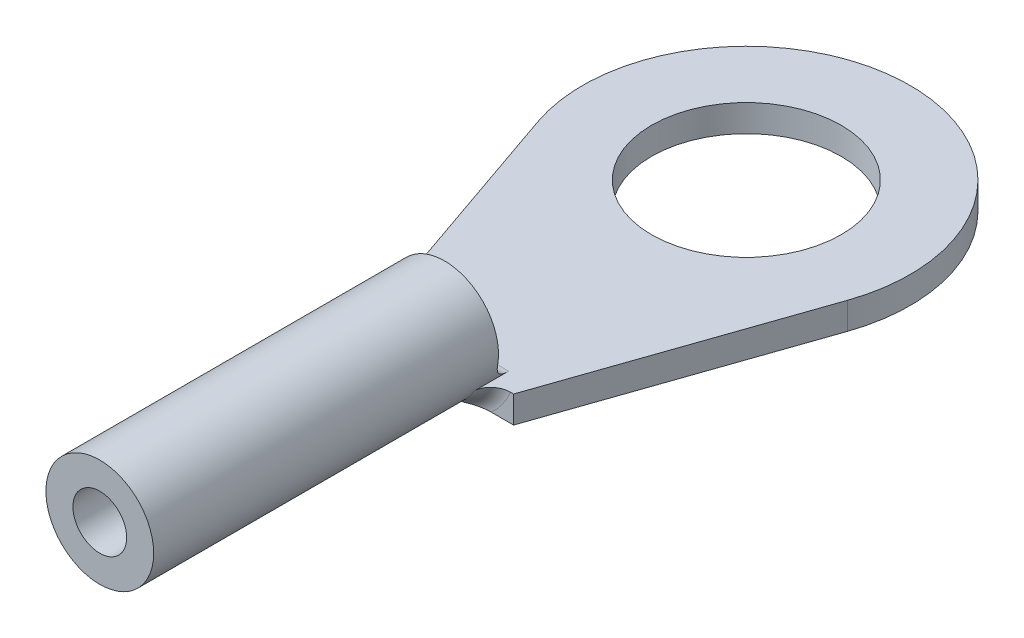
ISO-10303-21;
HEADER;
FILE_DESCRIPTION(('STEP AP214'),'2;1');
FILE_NAME('part.step','',(''),(''),'','','');
FILE_SCHEMA(('AUTOMOTIVE_DESIGN { 1 0 10303 214 1 1 1 1 }'));
ENDSEC;
DATA;
#1=APPLICATION_CONTEXT('core data for automotive mechanical design processes');
#2=APPLICATION_PROTOCOL_DEFINITION('international standard','automotive_design',2000,#1);
#3=PRODUCT_CONTEXT('',#1,'mechanical');
#4=PRODUCT('Part','Part','',(#3));
#5=PRODUCT_RELATED_PRODUCT_CATEGORY('part','',(#4));
#6=PRODUCT_DEFINITION_FORMATION('','',#4);
#7=PRODUCT_DEFINITION_CONTEXT('part definition',#1,'design');
#8=PRODUCT_DEFINITION('design','',#6,#7);
#9=PRODUCT_DEFINITION_SHAPE('','',#8);
#10=(LENGTH_UNIT() NAMED_UNIT(*) SI_UNIT(.MILLI.,.METRE.));
#11=(NAMED_UNIT(*) PLANE_ANGLE_UNIT() SI_UNIT($,.RADIAN.));
#12=(NAMED_UNIT(*) SI_UNIT($,.STERADIAN.) SOLID_ANGLE_UNIT());
#13=UNCERTAINTY_MEASURE_WITH_UNIT(LENGTH_MEASURE(1.E-05),#10,'distance_accuracy_value','');
#14=(GEOMETRIC_REPRESENTATION_CONTEXT(3) GLOBAL_UNCERTAINTY_ASSIGNED_CONTEXT((#13)) GLOBAL_UNIT_ASSIGNED_CONTEXT((#10,
#11,#12)) REPRESENTATION_CONTEXT('',''));
#15=CARTESIAN_POINT('',(0.,0.,0.));
#16=DIRECTION('',(0.,0.,1.));
#17=DIRECTION('',(1.,0.,0.));
#18=AXIS2_PLACEMENT_3D('',#15,#16,#17);
#19=CARTESIAN_POINT('',(1.016,0.396875,4.445));
#20=DIRECTION('',(0.,0.,-1.));
#21=DIRECTION('',(-1.,0.,0.));
#22=AXIS2_PLACEMENT_3D('',#19,#20,#21);
#23=PLANE('',#22);
#24=DIRECTION('',(1.,0.,0.));
#25=VECTOR('',#24,1.);
#26=CARTESIAN_POINT('',(1.016,0.,4.445));
#27=LINE('',#26,#25);
#28=CARTESIAN_POINT('',(-1.016,0.,4.445));
#29=VERTEX_POINT('',#28);
#30=CARTESIAN_POINT('',(-0.684874153211491,0.,4.445));
#31=VERTEX_POINT('',#30);
#32=EDGE_CURVE('E200',#29,#31,#27,.T.);
#33=ORIENTED_EDGE('',*,*,#32,.T.);
#34=CARTESIAN_POINT('',(0.,0.792923361216481,4.445));
#35=DIRECTION('',(0.,0.,-1.));
#36=DIRECTION('',(-1.,0.,0.));
#37=AXIS2_PLACEMENT_3D('',#34,#35,#36);
#38=CIRCLE('',#37,1.04775);
#39=CARTESIAN_POINT('',(-0.97001327726879,0.396875,4.445));
#40=VERTEX_POINT('',#39);
#41=EDGE_CURVE('E386',#31,#40,#38,.T.);
#42=ORIENTED_EDGE('',*,*,#41,.T.);
#43=DIRECTION('',(1.,0.,0.));
#44=VECTOR('',#43,1.);
#45=CARTESIAN_POINT('',(1.016,0.396875,4.445));
#46=LINE('',#45,#44);
#47=CARTESIAN_POINT('',(-1.016,0.396875,4.445));
#48=VERTEX_POINT('',#47);
#49=EDGE_CURVE('E363',#48,#40,#46,.T.);
#50=ORIENTED_EDGE('',*,*,#49,.F.);
#51=DIRECTION('',(0.,-1.,0.));
#52=VECTOR('',#51,1.);
#53=CARTESIAN_POINT('',(-1.016,0.396875,4.445));
#54=LINE('',#53,#52);
#55=EDGE_CURVE('E155',#48,#29,#54,.T.);
#56=ORIENTED_EDGE('',*,*,#55,.T.);
#57=EDGE_LOOP('',(#33,#42,#50,#56));
#58=FACE_BOUND('',#57,.T.);
#59=ADVANCED_FACE('F41',(#58),#23,.F.);
#60=CARTESIAN_POINT('',(0.,0.396875,0.));
#61=DIRECTION('',(0.,1.,0.));
#62=DIRECTION('',(0.,0.,1.));
#63=AXIS2_PLACEMENT_3D('',#60,#61,#62);
#64=PLANE('',#63);
#65=DIRECTION('',(1.,0.,0.));
#66=VECTOR('',#65,1.);
#67=CARTESIAN_POINT('',(0.,0.396875,4.191));
#68=LINE('',#67,#66);
#69=CARTESIAN_POINT('',(0.369697940889549,0.396875,4.191));
#70=VERTEX_POINT('',#69);
#71=CARTESIAN_POINT('',(0.687884262123898,0.396875,4.191));
#72=VERTEX_POINT('',#71);
#73=EDGE_CURVE('E285',#70,#72,#68,.T.);
#74=ORIENTED_EDGE('',*,*,#73,.T.);
#75=DIRECTION('',(0.,0.,-1.));
#76=VECTOR('',#75,1.);
#77=CARTESIAN_POINT('',(0.687884262123898,0.396875,9.525));
#78=LINE('',#77,#76);
#79=CARTESIAN_POINT('',(0.687884262116823,0.396875,4.69900000000365));
#80=VERTEX_POINT('',#79);
#81=EDGE_CURVE('E382',#80,#72,#78,.T.);
#82=ORIENTED_EDGE('',*,*,#81,.F.);
#83=CARTESIAN_POINT('',(0.97001327726879,0.396875,4.445));
#84=CARTESIAN_POINT('',(0.953113168477081,0.396875,4.44499379979826));
#85=CARTESIAN_POINT('',(0.936221132894472,0.396875,4.44644537969703));
#86=CARTESIAN_POINT('',(0.902913144314464,0.396875,4.45214806218975));
#87=CARTESIAN_POINT('',(0.886497251882933,0.396875,4.45639951931448));
#88=CARTESIAN_POINT('',(0.85460332847592,0.396875,4.46758679868527));
#89=CARTESIAN_POINT('',(0.839125455125773,0.396875,4.47452307065075));
#90=CARTESIAN_POINT('',(0.809568016035722,0.396875,4.49093199189131));
#91=CARTESIAN_POINT('',(0.795488696945248,0.396875,4.5004050874764));
#92=CARTESIAN_POINT('',(0.769428676180345,0.396875,4.52154168958541));
#93=CARTESIAN_POINT('',(0.757419245048958,0.396875,4.5331695894592));
#94=CARTESIAN_POINT('',(0.735777354986445,0.396875,4.55846071727123));
#95=CARTESIAN_POINT('',(0.72614251748817,0.396875,4.57212188635039));
#96=CARTESIAN_POINT('',(0.710599152501538,0.396875,4.59970711057377));
#97=CARTESIAN_POINT('',(0.70442066699444,0.396875,4.61347843939786));
#98=CARTESIAN_POINT('',(0.694855151516391,0.396875,4.64195689827558));
#99=CARTESIAN_POINT('',(0.691464774344167,0.396875,4.65666288332065));
#100=CARTESIAN_POINT('',(0.68797673927015,0.396875,4.6845135951715));
#101=CARTESIAN_POINT('',(0.687508445891591,0.396875,4.6976128675586));
#102=CARTESIAN_POINT('',(0.688879616707999,0.396875,4.72373802146532));
#103=CARTESIAN_POINT('',(0.69072758260189,0.396875,4.73676345530455));
#104=CARTESIAN_POINT('',(0.693734735208581,0.396875,4.74952321973601));
#105=B_SPLINE_CURVE_WITH_KNOTS('',3,(#83,#84,#85,#86,#87,#88,#89,#90,#91,#92,#93,#94,#95,#96,
#97,#98,#99,#100,#101,#102,#103,#104),.UNSPECIFIED.,.F.,.F.,(4,2,2,2,2,2,2,2,2,2,4),(0.,
0.0506277273101404,0.101261866522541,0.151904490870001,0.202556030767021,0.252435138837586,
0.302264079398994,0.347282094421044,0.392245984843998,0.43136681928469,0.470631665946946),.UNSPECIFIED.);
#106=CARTESIAN_POINT('',(0.97001327726879,0.396875,4.445));
#107=VERTEX_POINT('',#106);
#108=EDGE_CURVE('E229',#80,#107,#105,.F.);
#109=ORIENTED_EDGE('',*,*,#108,.T.);
#110=CARTESIAN_POINT('',(1.016,0.396875,4.445));
#111=VERTEX_POINT('',#110);
#112=EDGE_CURVE('E160',#107,#111,#46,.T.);
#113=ORIENTED_EDGE('',*,*,#112,.T.);
#114=DIRECTION('',(0.326838836782277,0.,-0.945080089077538));
#115=VECTOR('',#114,1.);
#116=CARTESIAN_POINT('',(2.2804782549441,0.396875,0.788662113155634));
#117=LINE('',#116,#115);
#118=CARTESIAN_POINT('',(2.2804782549441,0.396875,0.788662113155634));
#119=VERTEX_POINT('',#118);
#120=EDGE_CURVE('E168',#111,#119,#117,.T.);
#121=ORIENTED_EDGE('',*,*,#120,.T.);
#122=CARTESIAN_POINT('',(0.,0.396875,0.));
#123=DIRECTION('',(0.,1.,0.));
#124=DIRECTION('',(0.,0.,1.));
#125=AXIS2_PLACEMENT_3D('',#122,#123,#124);
#126=CIRCLE('',#125,2.413);
#127=CARTESIAN_POINT('',(-2.2804782549441,0.396875,0.788662113155635));
#128=VERTEX_POINT('',#127);
#129=EDGE_CURVE('E161',#119,#128,#126,.T.);
#130=ORIENTED_EDGE('',*,*,#129,.T.);
#131=DIRECTION('',(0.326838836782277,0.,0.945080089077538));
#132=VECTOR('',#131,1.);
#133=CARTESIAN_POINT('',(-1.016,0.396875,4.445));
#134=LINE('',#133,#132);
#135=EDGE_CURVE('E148',#128,#48,#134,.T.);
#136=ORIENTED_EDGE('',*,*,#135,.T.);
#137=ORIENTED_EDGE('',*,*,#49,.T.);
#138=CARTESIAN_POINT('',(-0.97001327726879,0.396875,4.445));
#139=CARTESIAN_POINT('',(-0.953113168477081,0.396875,4.44499379979826));
#140=CARTESIAN_POINT('',(-0.936221132894472,0.396875,4.44644537969703));
#141=CARTESIAN_POINT('',(-0.902913144314464,0.396875,4.45214806218975));
#142=CARTESIAN_POINT('',(-0.886497251882933,0.396875,4.45639951931448));
#143=CARTESIAN_POINT('',(-0.85460332847592,0.396875,4.46758679868527));
#144=CARTESIAN_POINT('',(-0.839125455125773,0.396875,4.47452307065075));
#145=CARTESIAN_POINT('',(-0.809568016035722,0.396875,4.49093199189131));
#146=CARTESIAN_POINT('',(-0.795488696945248,0.396875,4.5004050874764));
#147=CARTESIAN_POINT('',(-0.769428676180345,0.396875,4.52154168958541));
#148=CARTESIAN_POINT('',(-0.757419245048958,0.396875,4.5331695894592));
#149=CARTESIAN_POINT('',(-0.735777354986445,0.396875,4.55846071727123));
#150=CARTESIAN_POINT('',(-0.72614251748817,0.396875,4.57212188635039));
#151=CARTESIAN_POINT('',(-0.710599152501538,0.396875,4.59970711057377));
#152=CARTESIAN_POINT('',(-0.70442066699444,0.396875,4.61347843939786));
#153=CARTESIAN_POINT('',(-0.694855151516391,0.396875,4.64195689827558));
#154=CARTESIAN_POINT('',(-0.691464774344167,0.396875,4.65666288332065));
#155=CARTESIAN_POINT('',(-0.68797673927015,0.396875,4.6845135951715));
#156=CARTESIAN_POINT('',(-0.687508445891591,0.396875,4.6976128675586));
#157=CARTESIAN_POINT('',(-0.688879616707999,0.396875,4.72373802146532));
#158=CARTESIAN_POINT('',(-0.69072758260189,0.396875,4.73676345530455));
#159=CARTESIAN_POINT('',(-0.693734735208581,0.396875,4.74952321973601));
#160=B_SPLINE_CURVE_WITH_KNOTS('',3,(#138,#139,#140,#141,#142,#143,#144,#145,#146,#147,#148,
#149,#150,#151,#152,#153,#154,#155,#156,#157,#158,#159),.UNSPECIFIED.,.F.,.F.,(4,2,2,2,2,2,2,2,
2,2,4),(0.,0.0506277273101404,0.101261866522541,0.151904490870001,0.202556030767021,
0.252435138837586,0.302264079398994,0.347282094421044,0.392245984843998,0.43136681928469,
0.470631665946946),.UNSPECIFIED.);
#161=CARTESIAN_POINT('',(-0.687884262123898,0.396875,4.69900000000365));
#162=VERTEX_POINT('',#161);
#163=EDGE_CURVE('E259',#40,#162,#160,.T.);
#164=ORIENTED_EDGE('',*,*,#163,.T.);
#165=DIRECTION('',(0.,0.,-1.));
#166=VECTOR('',#165,1.);
#167=CARTESIAN_POINT('',(-0.687884262123898,0.396875,9.525));
#168=LINE('',#167,#166);
#169=CARTESIAN_POINT('',(-0.687884262123898,0.396875,4.191));
#170=VERTEX_POINT('',#169);
#171=EDGE_CURVE('E179',#170,#162,#168,.F.);
#172=ORIENTED_EDGE('',*,*,#171,.F.);
#173=DIRECTION('',(1.,0.,0.));
#174=VECTOR('',#173,1.);
#175=CARTESIAN_POINT('',(0.,0.396875,4.191));
#176=LINE('',#175,#174);
#177=CARTESIAN_POINT('',(-0.369697940889549,0.396875,4.191));
#178=VERTEX_POINT('',#177);
#179=EDGE_CURVE('E266',#170,#178,#176,.T.);
#180=ORIENTED_EDGE('',*,*,#179,.T.);
#181=CARTESIAN_POINT('',(-0.438050456634923,0.396875,4.19931485611738));
#182=CARTESIAN_POINT('',(-0.371528569790791,0.396875,4.46586516566242));
#183=CARTESIAN_POINT('',(-0.376735805121144,0.670757745915023,4.445));
#184=CARTESIAN_POINT('',(-0.42346815289965,0.396875,4.1956754147437));
#185=CARTESIAN_POINT('',(-0.372497447198272,0.396875,4.46202894775704));
#186=CARTESIAN_POINT('',(-0.375536136071169,0.667068913059829,4.445));
#187=CARTESIAN_POINT('',(-0.408622538586615,0.396875,4.19324622251476));
#188=CARTESIAN_POINT('',(-0.372703600518065,0.396875,4.45762004929181));
#189=CARTESIAN_POINT('',(-0.374167406773621,0.663013558211402,4.445));
#190=CARTESIAN_POINT('',(-0.378790975851847,0.396875,4.19075081951769));
#191=CARTESIAN_POINT('',(-0.371083486695165,0.396875,4.44815024250578));
#192=CARTESIAN_POINT('',(-0.370916900984393,0.65400869301977,4.445));
#193=CARTESIAN_POINT('',(-0.363805816638111,0.396875,4.19067528324049));
#194=CARTESIAN_POINT('',(-0.369304061602988,0.396875,4.44311896673456));
#195=CARTESIAN_POINT('',(-0.369037179008474,0.649062789575588,4.445));
#196=CARTESIAN_POINT('',(-0.317084750986763,0.396875,4.19400432967637));
#197=CARTESIAN_POINT('',(-0.360133215127646,0.396875,4.42721474634604));
#198=CARTESIAN_POINT('',(-0.362064552821221,0.631884316259954,4.445));
#199=CARTESIAN_POINT('',(-0.285570516746069,0.396875,4.20144119568101));
#200=CARTESIAN_POINT('',(-0.348861857867806,0.396875,4.41592134037888));
#201=CARTESIAN_POINT('',(-0.355741905745716,0.617736754891956,4.445));
#202=CARTESIAN_POINT('',(-0.235471092423827,0.396875,4.22093195650366));
#203=CARTESIAN_POINT('',(-0.319885354028476,0.396875,4.40069957799131));
#204=CARTESIAN_POINT('',(-0.33975934218213,0.588982578991578,4.445));
#205=CARTESIAN_POINT('',(-0.215943030268846,0.396875,4.23078983953631));
#206=CARTESIAN_POINT('',(-0.305841649691806,0.396875,4.39561603030791));
#207=CARTESIAN_POINT('',(-0.331780961478449,0.575928111662142,4.445));
#208=CARTESIAN_POINT('',(-0.17873120481102,0.396875,4.25356659116584));
#209=CARTESIAN_POINT('',(-0.273134728914795,0.396875,4.38898171832222));
#210=CARTESIAN_POINT('',(-0.311085802750038,0.54716646552175,4.445));
#211=CARTESIAN_POINT('',(-0.161050068486967,0.396875,4.26648973649967));
#212=CARTESIAN_POINT('',(-0.254727509964974,0.396875,4.38730919829586));
#213=CARTESIAN_POINT('',(-0.298362390004388,0.531455589291719,4.445));
#214=CARTESIAN_POINT('',(-0.13062330258754,0.396875,4.2920001976851));
#215=CARTESIAN_POINT('',(-0.218045397210324,0.396875,4.3880167616671));
#216=CARTESIAN_POINT('',(-0.269079188470506,0.501719208614801,4.445));
#217=CARTESIAN_POINT('',(-0.117563678003043,0.396875,4.30422468649624));
#218=CARTESIAN_POINT('',(-0.200553549659194,0.396875,4.38961376708487));
#219=CARTESIAN_POINT('',(-0.253631076225797,0.487903574336426,4.445));
#220=CARTESIAN_POINT('',(-0.0925419221672624,0.396875,4.32972027662405));
#221=CARTESIAN_POINT('',(-0.164088414915376,0.396875,4.39535947503581));
#222=CARTESIAN_POINT('',(-0.217359630646184,0.46108761065983,4.445));
#223=CARTESIAN_POINT('',(-0.0805789961419099,0.396875,4.34299060684304));
#224=CARTESIAN_POINT('',(-0.145101840304279,0.396875,4.39943858304825));
#225=CARTESIAN_POINT('',(-0.196540232274989,0.448086693035993,4.445));
#226=CARTESIAN_POINT('',(-0.057258790375472,0.396875,4.37044175167298));
#227=CARTESIAN_POINT('',(-0.10599697316308,0.396875,4.40964167173969));
#228=CARTESIAN_POINT('',(-0.14922143681596,0.425112800366022,4.445));
#229=CARTESIAN_POINT('',(-0.0459157657408443,0.396875,4.38463443252103));
#230=CARTESIAN_POINT('',(-0.0857213581902205,0.396875,4.41579417390941));
#231=CARTESIAN_POINT('',(-0.122629051220672,0.415196770854555,4.445));
#232=CARTESIAN_POINT('',(-0.0236804352132499,0.396875,4.4133641512922));
#233=CARTESIAN_POINT('',(-0.0449582730761471,0.396875,4.42916511951768));
#234=CARTESIAN_POINT('',(-0.0658409018760792,0.401301985242469,4.445));
#235=CARTESIAN_POINT('',(-0.0127881697176035,0.396875,4.42790121989679));
#236=CARTESIAN_POINT('',(-0.0242273185242391,0.396875,4.43644972167148));
#237=CARTESIAN_POINT('',(-0.0356448160986853,0.397323760176102,4.445));
#238=CARTESIAN_POINT('',(-0.00127262101646477,0.396875,4.44329824131764));
#239=CARTESIAN_POINT('',(-0.00241047746459529,0.396875,4.44414908511182));
#240=CARTESIAN_POINT('',(-0.00354831116133036,0.396886601605052,4.445));
#241=CARTESIAN_POINT('',(-0.000636309440053576,0.396875,4.4441491213414));
#242=CARTESIAN_POINT('',(-0.00120523887417995,0.396875,4.44457453232204));
#243=CARTESIAN_POINT('',(-0.00177420489996151,0.39687464211075,4.445));
#244=CARTESIAN_POINT('',(0.,0.396875,4.445));
#245=CARTESIAN_POINT('',(0.,0.396875,4.445));
#246=CARTESIAN_POINT('',(-1.66807754901378E-13,0.396875,4.445));
#247=(BOUNDED_SURFACE() B_SPLINE_SURFACE(3,2,((#181,#182,#183),(#184,#185,#186),(#187,#188,
#189),(#190,#191,#192),(#193,#194,#195),(#196,#197,#198),(#199,#200,#201),(#202,#203,#204),
(#205,#206,#207),(#208,#209,#210),(#211,#212,#213),(#214,#215,#216),(#217,#218,#219),(#220,#221,
#222),(#223,#224,#225),(#226,#227,#228),(#229,#230,#231),(#232,#233,#234),(#235,#236,#237),
(#238,#239,#240),(#241,#242,#243),(#244,#245,#246)),.UNSPECIFIED.,.F.,.F.,
.F.) B_SPLINE_SURFACE_WITH_KNOTS((4,2,2,2,2,2,2,2,2,2,4),(3,3),(0.,0.0449728334012965,
0.0897674554880409,0.185220447600356,0.250567539459265,0.316006347294479,0.369597159735162,
0.423148822884823,0.477637255878906,0.532130561632126,0.535318037084181),(0.,1.),
.UNSPECIFIED.) GEOMETRIC_REPRESENTATION_ITEM() RATIONAL_B_SPLINE_SURFACE(((1.,0.678867245039669,
1.),(1.,0.684210451271191,1.),(1.,0.690032087709301,1.),(1.,0.702761154202002,1.),(1.,
0.70966419022886,1.),(1.,0.733241025612079,1.),(1.,0.752136030943677,1.),(1.,0.788703444555961,
1.),(1.,0.80488183550375,1.),(1.,0.839310303939397,1.),(1.,0.857563257212249,1.),(1.,
0.890977174324726,1.),(1.,0.906099611340348,1.),(1.,0.934773614567629,1.),(1.,0.948326320265375,
1.),(1.,0.971883790518978,1.),(1.,0.981822344450001,1.),(1.,0.995660391089009,1.),(1.,
0.999559343659943,1.),(1.,0.999988519810192,1.),(1.,1.0000002836141,1.),(1.,1.,1.))) REPRESENTATION_ITEM('') SURFACE());
#248=CARTESIAN_POINT('',(-0.438050456634923,0.396875,4.19931485611738));
#249=CARTESIAN_POINT('',(-0.423468152899651,0.396875,4.1956754147437));
#250=CARTESIAN_POINT('',(-0.408622538586615,0.396875,4.19324622251476));
#251=CARTESIAN_POINT('',(-0.378790975851847,0.396875,4.19075081951769));
#252=CARTESIAN_POINT('',(-0.363805816638111,0.396875,4.19067528324048));
#253=CARTESIAN_POINT('',(-0.317084750986763,0.396875,4.19400432967637));
#254=CARTESIAN_POINT('',(-0.285570516746069,0.396875,4.20144119568101));
#255=CARTESIAN_POINT('',(-0.235471092423827,0.396875,4.22093195650366));
#256=CARTESIAN_POINT('',(-0.215943030268846,0.396875,4.23078983953631));
#257=CARTESIAN_POINT('',(-0.17873120481102,0.396875,4.25356659116584));
#258=CARTESIAN_POINT('',(-0.161050068486967,0.396875,4.26648973649967));
#259=CARTESIAN_POINT('',(-0.13062330258754,0.396875,4.2920001976851));
#260=CARTESIAN_POINT('',(-0.117563678003043,0.396875,4.30422468649624));
#261=CARTESIAN_POINT('',(-0.0925419221672624,0.396875,4.32972027662405));
#262=CARTESIAN_POINT('',(-0.0805789961419099,0.396875,4.34299060684304));
#263=CARTESIAN_POINT('',(-0.057258790375472,0.396875,4.37044175167298));
#264=CARTESIAN_POINT('',(-0.0459157657408443,0.396875,4.38463443252103));
#265=CARTESIAN_POINT('',(-0.0236804352132499,0.396875,4.4133641512922));
#266=CARTESIAN_POINT('',(-0.0127881697176036,0.396875,4.42790121989679));
#267=CARTESIAN_POINT('',(-0.00127262101646477,0.396875,4.44329824131764));
#268=CARTESIAN_POINT('',(-0.000636309440053576,0.396875,4.4441491213414));
#269=CARTESIAN_POINT('',(0.,0.396875,4.445));
#270=B_SPLINE_CURVE_WITH_KNOTS('',3,(#248,#249,#250,#251,#252,#253,#254,#255,#256,#257,#258,
#259,#260,#261,#262,#263,#264,#265,#266,#267,#268,#269),.UNSPECIFIED.,.F.,.F.,(4,2,2,2,2,2,2,2,
2,2,4),(0.,0.0449728334012965,0.0897674554880409,0.185220447600356,0.250567539459265,
0.316006347294479,0.369597159735162,0.423148822884823,0.477637255878906,0.532130561632126,
0.535318037084181),.UNSPECIFIED.);
#271=CARTESIAN_POINT('',(0.,0.396875,4.445));
#272=VERTEX_POINT('',#271);
#273=EDGE_CURVE('E270',#178,#272,#270,.T.);
#274=ORIENTED_EDGE('',*,*,#273,.T.);
#275=CARTESIAN_POINT('',(0.376735806164638,0.670757749132964,4.445));
#276=CARTESIAN_POINT('',(0.371528570008626,0.396875,4.46586516932617));
#277=CARTESIAN_POINT('',(0.438050456634168,0.396875,4.19931485611719));
#278=CARTESIAN_POINT('',(0.375536136456955,0.667068914245214,4.445));
#279=CARTESIAN_POINT('',(0.372497447281311,0.396875,4.46202894908654));
#280=CARTESIAN_POINT('',(0.423468152899111,0.396875,4.19567541474367));
#281=CARTESIAN_POINT('',(0.374167406879548,0.663013558535909,4.445));
#282=CARTESIAN_POINT('',(0.372703600540972,0.396875,4.45762004964975));
#283=CARTESIAN_POINT('',(0.408622538586305,0.396875,4.1932462225148));
#284=CARTESIAN_POINT('',(0.370916900878985,0.654008692696824,4.445));
#285=CARTESIAN_POINT('',(0.371083486673928,0.396875,4.44815024216244));
#286=CARTESIAN_POINT('',(0.378790975851523,0.396875,4.19075081951772));
#287=CARTESIAN_POINT('',(0.369037178970197,0.649062789461794,4.445));
#288=CARTESIAN_POINT('',(0.369304061595243,0.396875,4.44311896661592));
#289=CARTESIAN_POINT('',(0.363805816637539,0.396875,4.1906752832405));
#290=CARTESIAN_POINT('',(0.362064552902963,0.631884316502874,4.445));
#291=CARTESIAN_POINT('',(0.360133215139359,0.396875,4.42721474658349));
#292=CARTESIAN_POINT('',(0.31708475098593,0.396875,4.19400432967648));
#293=CARTESIAN_POINT('',(0.355741905778346,0.617736754945166,4.445));
#294=CARTESIAN_POINT('',(0.34886185787865,0.396875,4.41592134042839));
#295=CARTESIAN_POINT('',(0.285570516745234,0.396875,4.20144119568124));
#296=CARTESIAN_POINT('',(0.339759342159177,0.588982578954042,4.445));
#297=CARTESIAN_POINT('',(0.319885354022353,0.396875,4.40069957795942));
#298=CARTESIAN_POINT('',(0.235471092422971,0.396875,4.22093195650406));
#299=CARTESIAN_POINT('',(0.331780961440453,0.575928111651385,4.445));
#300=CARTESIAN_POINT('',(0.305841649670212,0.396875,4.39561603029962));
#301=CARTESIAN_POINT('',(0.215943030267969,0.396875,4.23078983953678));
#302=CARTESIAN_POINT('',(0.311085802787448,0.547166465531634,4.445));
#303=CARTESIAN_POINT('',(0.273134728933806,0.396875,4.38898171832996));
#304=CARTESIAN_POINT('',(0.178731204810114,0.396875,4.25356659116646));
#305=CARTESIAN_POINT('',(0.298362390132396,0.53145558929542,4.445));
#306=CARTESIAN_POINT('',(0.254727510038881,0.396875,4.38730919829769));
#307=CARTESIAN_POINT('',(0.161050068486052,0.396875,4.26648973650036));
#308=CARTESIAN_POINT('',(0.269079188365073,0.501719208611158,4.445));
#309=CARTESIAN_POINT('',(0.218045397151176,0.396875,4.38801676166594));
#310=CARTESIAN_POINT('',(0.13062330258672,0.396875,4.29200019768584));
#311=CARTESIAN_POINT('',(0.253631075868481,0.48790357433094,4.445));
#312=CARTESIAN_POINT('',(0.200553549460881,0.396875,4.38961376708498));
#313=CARTESIAN_POINT('',(0.117563678002317,0.396875,4.30422468649694));
#314=CARTESIAN_POINT('',(0.217359631002306,0.461087610664623,4.445));
#315=CARTESIAN_POINT('',(0.164088415106079,0.396875,4.39535947503614));
#316=CARTESIAN_POINT('',(0.0925419221667086,0.396875,4.32972027662465));
#317=CARTESIAN_POINT('',(0.196540233595544,0.448086693052897,4.445));
#318=CARTESIAN_POINT('',(0.145101841002646,0.396875,4.39943858304772));
#319=CARTESIAN_POINT('',(0.0805789961414351,0.396875,4.34299060684359));
#320=CARTESIAN_POINT('',(0.149221435468319,0.425112800346885,4.445));
#321=CARTESIAN_POINT('',(0.105996972467709,0.396875,4.40964167174026));
#322=CARTESIAN_POINT('',(0.0572587903751434,0.396875,4.37044175167338));
#323=CARTESIAN_POINT('',(0.122629046159694,0.415196770786208,4.445));
#324=CARTESIAN_POINT('',(0.0857213556072511,0.396875,4.41579417391124));
#325=CARTESIAN_POINT('',(0.0459157657405821,0.396875,4.38463443252134));
#326=CARTESIAN_POINT('',(0.0658409069369139,0.401301985310676,4.445));
#327=CARTESIAN_POINT('',(0.0449582756201905,0.396875,4.42916511951701));
#328=CARTESIAN_POINT('',(0.0236804352131194,0.396875,4.41336415129236));
#329=CARTESIAN_POINT('',(0.0356448349962376,0.397323760430097,4.445));
#330=CARTESIAN_POINT('',(0.0242273279818993,0.396875,4.43644972167034));
#331=CARTESIAN_POINT('',(0.0127881697175385,0.396875,4.42790121989686));
#332=CARTESIAN_POINT('',(0.00354831332327083,0.396886601634105,4.445));
#333=CARTESIAN_POINT('',(0.00241047854577183,0.396875,4.44414908511191));
#334=CARTESIAN_POINT('',(0.00127262101646417,0.396875,4.44329824131764));
#335=CARTESIAN_POINT('',(0.00177420603563592,0.396874642126009,4.445));
#336=CARTESIAN_POINT('',(0.00120523944224726,0.396875,4.44457453232209));
#337=CARTESIAN_POINT('',(0.000636309440053278,0.396875,4.4441491213414));
#338=CARTESIAN_POINT('',(4.4877505838126E-13,0.396875,4.445));
#339=CARTESIAN_POINT('',(4.4877505838126E-13,0.396875,4.445));
#340=CARTESIAN_POINT('',(0.,0.396875,4.445));
#341=(BOUNDED_SURFACE() B_SPLINE_SURFACE(3,2,((#275,#276,#277),(#278,#279,#280),(#281,#282,
#283),(#284,#285,#286),(#287,#288,#289),(#290,#291,#292),(#293,#294,#295),(#296,#297,#298),
(#299,#300,#301),(#302,#303,#304),(#305,#306,#307),(#308,#309,#310),(#311,#312,#313),(#314,#315,
#316),(#317,#318,#319),(#320,#321,#322),(#323,#324,#325),(#326,#327,#328),(#329,#330,#331),
(#332,#333,#334),(#335,#336,#337),(#338,#339,#340)),.UNSPECIFIED.,.F.,.F.,
.F.) B_SPLINE_SURFACE_WITH_KNOTS((4,2,2,2,2,2,2,2,2,2,4),(3,3),(0.,0.0449728334005867,
0.0897674554880711,0.185220447600456,0.250567539459522,0.316006347294893,0.369597159735289,
0.423148822884662,0.477637255878424,0.53213056163134,0.535318037083395),(0.,1.),
.UNSPECIFIED.) GEOMETRIC_REPRESENTATION_ITEM() RATIONAL_B_SPLINE_SURFACE(((1.,0.678867240374155,
1.),(1.,0.684210449552561,1.),(1.,0.690032087238812,1.),(1.,0.702761154670232,1.),(1.,
0.709664190393856,1.),(1.,0.733241025259892,1.),(1.,0.75213603086653,1.),(1.,0.788703444610184,
1.),(1.,0.804881835519017,1.),(1.,0.839310303925171,1.),(1.,0.857563257207556,1.),(1.,
0.890977174329257,1.),(1.,0.906099611346018,1.),(1.,0.934773614562701,1.),(1.,0.948326320248717,
1.),(1.,0.971883790537913,1.),(1.,0.981822344517297,1.),(1.,0.995660391021847,1.),(1.,
0.999559343409938,1.),(1.,0.999988519781596,1.),(1.,1.00000028359908,1.),(1.,1.,1.))) REPRESENTATION_ITEM('') SURFACE());
#342=CARTESIAN_POINT('',(0.438050456634168,0.396875,4.19931485611719));
#343=CARTESIAN_POINT('',(0.423468152899111,0.396875,4.19567541474367));
#344=CARTESIAN_POINT('',(0.408622538586305,0.396875,4.1932462225148));
#345=CARTESIAN_POINT('',(0.378790975851523,0.396875,4.19075081951772));
#346=CARTESIAN_POINT('',(0.363805816637539,0.396875,4.1906752832405));
#347=CARTESIAN_POINT('',(0.31708475098593,0.396875,4.19400432967648));
#348=CARTESIAN_POINT('',(0.285570516745234,0.396875,4.20144119568124));
#349=CARTESIAN_POINT('',(0.235471092422971,0.396875,4.22093195650406));
#350=CARTESIAN_POINT('',(0.215943030267969,0.396875,4.23078983953678));
#351=CARTESIAN_POINT('',(0.178731204810114,0.396875,4.25356659116646));
#352=CARTESIAN_POINT('',(0.161050068486052,0.396875,4.26648973650036));
#353=CARTESIAN_POINT('',(0.13062330258672,0.396875,4.29200019768584));
#354=CARTESIAN_POINT('',(0.117563678002317,0.396875,4.30422468649694));
#355=CARTESIAN_POINT('',(0.0925419221667086,0.396875,4.32972027662465));
#356=CARTESIAN_POINT('',(0.0805789961414351,0.396875,4.34299060684359));
#357=CARTESIAN_POINT('',(0.0572587903751434,0.396875,4.37044175167338));
#358=CARTESIAN_POINT('',(0.0459157657405821,0.396875,4.38463443252134));
#359=CARTESIAN_POINT('',(0.0236804352131194,0.396875,4.41336415129236));
#360=CARTESIAN_POINT('',(0.0127881697175385,0.396875,4.42790121989687));
#361=CARTESIAN_POINT('',(0.00127262101646417,0.396875,4.44329824131764));
#362=CARTESIAN_POINT('',(0.000636309440053278,0.396875,4.4441491213414));
#363=CARTESIAN_POINT('',(0.,0.396875,4.445));
#364=B_SPLINE_CURVE_WITH_KNOTS('',3,(#342,#343,#344,#345,#346,#347,#348,#349,#350,#351,#352,
#353,#354,#355,#356,#357,#358,#359,#360,#361,#362,#363),.UNSPECIFIED.,.F.,.F.,(4,2,2,2,2,2,2,2,
2,2,4),(0.,0.0449728334005867,0.0897674554880711,0.185220447600456,0.250567539459522,
0.316006347294893,0.369597159735289,0.423148822884662,0.477637255878424,0.53213056163134,
0.535318037083395),.UNSPECIFIED.);
#365=EDGE_CURVE('E277',#272,#70,#364,.F.);
#366=ORIENTED_EDGE('',*,*,#365,.T.);
#367=EDGE_LOOP('',(#74,#82,#109,#113,#121,#130,#136,#137,#164,#172,#180,#274,#366));
#368=FACE_BOUND('',#367,.T.);
#369=CARTESIAN_POINT('',(0.,0.396875,0.));
#370=DIRECTION('',(0.,1.,0.));
#371=DIRECTION('',(0.,0.,1.));
#372=AXIS2_PLACEMENT_3D('',#369,#370,#371);
#373=CIRCLE('',#372,1.397);
#374=CARTESIAN_POINT('',(0.,0.396875,1.397));
#375=VERTEX_POINT('',#374);
#376=EDGE_CURVE('E349',#375,#375,#373,.T.);
#377=ORIENTED_EDGE('',*,*,#376,.F.);
#378=EDGE_LOOP('',(#377));
#379=FACE_BOUND('',#378,.T.);
#380=ADVANCED_FACE('F165',(#368,#379),#64,.T.);
#381=CARTESIAN_POINT('',(0.,0.,0.));
#382=DIRECTION('',(0.,1.,0.));
#383=DIRECTION('',(0.,0.,1.));
#384=AXIS2_PLACEMENT_3D('',#381,#382,#383);
#385=PLANE('',#384);
#386=CARTESIAN_POINT('',(0.,0.,0.));
#387=DIRECTION('',(0.,1.,0.));
#388=DIRECTION('',(0.,0.,1.));
#389=AXIS2_PLACEMENT_3D('',#386,#387,#388);
#390=CIRCLE('',#389,2.413);
#391=CARTESIAN_POINT('',(2.2804782549441,0.,0.788662113155634));
#392=VERTEX_POINT('',#391);
#393=CARTESIAN_POINT('',(-2.2804782549441,0.,0.788662113155635));
#394=VERTEX_POINT('',#393);
#395=EDGE_CURVE('E177',#392,#394,#390,.T.);
#396=ORIENTED_EDGE('',*,*,#395,.F.);
#397=DIRECTION('',(0.326838836782277,0.,-0.945080089077538));
#398=VECTOR('',#397,1.);
#399=CARTESIAN_POINT('',(2.2804782549441,0.,0.788662113155634));
#400=LINE('',#399,#398);
#401=CARTESIAN_POINT('',(1.016,0.,4.445));
#402=VERTEX_POINT('',#401);
#403=EDGE_CURVE('E173',#402,#392,#400,.T.);
#404=ORIENTED_EDGE('',*,*,#403,.F.);
#405=CARTESIAN_POINT('',(0.684874153211491,0.,4.445));
#406=VERTEX_POINT('',#405);
#407=EDGE_CURVE('E373',#406,#402,#27,.T.);
#408=ORIENTED_EDGE('',*,*,#407,.F.);
#409=CARTESIAN_POINT('',(0.684874153211491,0.,4.445));
#410=CARTESIAN_POINT('',(0.665244303647132,0.,4.44500536316527));
#411=CARTESIAN_POINT('',(0.645641335589722,0.,4.44597106624807));
#412=CARTESIAN_POINT('',(0.60662645780881,0.,4.44957134804765));
#413=CARTESIAN_POINT('',(0.587214238321877,0.,4.45220249432188));
#414=CARTESIAN_POINT('',(0.529864986085313,0.,4.46213508735109));
#415=CARTESIAN_POINT('',(0.492285163914126,0.,4.47148966644158));
#416=CARTESIAN_POINT('',(0.416048667170415,0.,4.49491544680396));
#417=CARTESIAN_POINT('',(0.377477488986031,0.,4.50925065477777));
#418=CARTESIAN_POINT('',(0.301470702569782,0.,4.54111645404458));
#419=CARTESIAN_POINT('',(0.264042064283143,0.,4.55866331733321));
#420=CARTESIAN_POINT('',(0.213373109626407,0.,4.58422357980571));
#421=CARTESIAN_POINT('',(0.199660221083545,0.,4.59132767313002));
#422=CARTESIAN_POINT('',(0.172369333624939,0.,4.60580268259192));
#423=CARTESIAN_POINT('',(0.158791376277815,0.,4.613173677894));
#424=CARTESIAN_POINT('',(0.131854262202864,0.,4.62816161560182));
#425=CARTESIAN_POINT('',(0.118494390181276,0.,4.635777283557));
#426=CARTESIAN_POINT('',(0.0919665621336627,0.,4.6513306823313));
#427=CARTESIAN_POINT('',(0.0787985117807474,0.,4.65926824705693));
#428=CARTESIAN_POINT('',(0.0612949614046666,0.,4.67102592732743));
#429=CARTESIAN_POINT('',(0.0566129348425084,0.,4.67429600307017));
#430=CARTESIAN_POINT('',(0.0498621371211271,0.,4.67959309732414));
#431=CARTESIAN_POINT('',(0.0476468705967131,0.,4.68143432434661));
#432=CARTESIAN_POINT('',(0.0434301169629903,0.,4.68535138692714));
#433=CARTESIAN_POINT('',(0.041427313504119,0.,4.68742559119532));
#434=CARTESIAN_POINT('',(0.0392288136049844,0.,4.69045057259058));
#435=CARTESIAN_POINT('',(0.0387431036874396,0.,4.691182905694));
#436=CARTESIAN_POINT('',(0.0378673032244556,0.,4.69270244664993));
#437=CARTESIAN_POINT('',(0.0374770087707397,0.,4.69348953278174));
#438=CARTESIAN_POINT('',(0.0368935949488889,0.,4.69496723541013));
#439=CARTESIAN_POINT('',(0.0366772786602313,0.,4.69564847035695));
#440=CARTESIAN_POINT('',(0.0363614565814245,0.,4.69703798597023));
#441=CARTESIAN_POINT('',(0.0362618212236527,0.,4.69774623573375));
#442=CARTESIAN_POINT('',(0.0361957309340772,0.,4.6991694969895));
#443=CARTESIAN_POINT('',(0.0362294082230738,0.,4.69988451449273));
#444=CARTESIAN_POINT('',(0.0364217457633567,0.,4.70130377997999));
#445=CARTESIAN_POINT('',(0.036581439384752,0.,4.7020078896229));
#446=CARTESIAN_POINT('',(0.0367995004867223,0.,4.70269191674701));
#447=B_SPLINE_CURVE_WITH_KNOTS('',3,(#409,#410,#411,#412,#413,#414,#415,#416,#417,#418,#419,
#420,#421,#422,#423,#424,#425,#426,#427,#428,#429,#430,#431,#432,#433,#434,#435,#436,#437,#438,
#439,#440,#441,#442,#443,#444,#445,#446),.UNSPECIFIED.,.F.,.F.,(4,2,2,2,2,2,2,2,2,2,2,2,2,2,2,2,
2,2,4),(0.,0.0588257118170445,0.117530578117713,0.233366690156656,0.356631434500131,
0.480538920923057,0.526869762095508,0.573214459645822,0.61934787536184,0.665457782536109,
0.682568571642128,0.691210768565148,0.699795837883565,0.702427316941652,0.705053122231141,
0.707189261327028,0.709323026104352,0.71145890770064,0.713612488473399),.UNSPECIFIED.);
#448=CARTESIAN_POINT('',(0.0362160977626961,0.,4.699));
#449=VERTEX_POINT('',#448);
#450=EDGE_CURVE('E220',#406,#449,#447,.T.);
#451=ORIENTED_EDGE('',*,*,#450,.T.);
#452=DIRECTION('',(0.,0.,-1.));
#453=VECTOR('',#452,1.);
#454=CARTESIAN_POINT('',(0.0362160977626961,0.,9.525));
#455=LINE('',#454,#453);
#456=CARTESIAN_POINT('',(0.0362160977626961,0.,4.445));
#457=VERTEX_POINT('',#456);
#458=EDGE_CURVE('E407',#457,#449,#455,.F.);
#459=ORIENTED_EDGE('',*,*,#458,.F.);
#460=CARTESIAN_POINT('',(0.,0.792923361216481,4.445));
#461=DIRECTION('',(0.,0.,1.));
#462=DIRECTION('',(-0.045626579858515,-0.998958565312103,0.));
#463=AXIS2_PLACEMENT_3D('',#460,#461,#462);
#464=CIRCLE('',#463,0.79375);
#465=CARTESIAN_POINT('',(-0.0362160977626961,0.,4.445));
#466=VERTEX_POINT('',#465);
#467=EDGE_CURVE('E195',#466,#457,#464,.T.);
#468=ORIENTED_EDGE('',*,*,#467,.F.);
#469=DIRECTION('',(0.,0.,-1.));
#470=VECTOR('',#469,1.);
#471=CARTESIAN_POINT('',(-0.0362160977626961,0.,9.525));
#472=LINE('',#471,#470);
#473=CARTESIAN_POINT('',(-0.0362160977626968,0.,4.699));
#474=VERTEX_POINT('',#473);
#475=EDGE_CURVE('E411',#474,#466,#472,.T.);
#476=ORIENTED_EDGE('',*,*,#475,.F.);
#477=CARTESIAN_POINT('',(-0.684874153211491,0.,4.445));
#478=CARTESIAN_POINT('',(-0.665244303647132,0.,4.44500536316527));
#479=CARTESIAN_POINT('',(-0.645641335589722,0.,4.44597106624807));
#480=CARTESIAN_POINT('',(-0.60662645780881,0.,4.44957134804765));
#481=CARTESIAN_POINT('',(-0.587214238321877,0.,4.45220249432188));
#482=CARTESIAN_POINT('',(-0.529864986085313,0.,4.46213508735109));
#483=CARTESIAN_POINT('',(-0.492285163914126,0.,4.47148966644158));
#484=CARTESIAN_POINT('',(-0.416048667170415,0.,4.49491544680396));
#485=CARTESIAN_POINT('',(-0.377477488986031,0.,4.50925065477777));
#486=CARTESIAN_POINT('',(-0.301470702569782,0.,4.54111645404458));
#487=CARTESIAN_POINT('',(-0.264042064283143,0.,4.55866331733321));
#488=CARTESIAN_POINT('',(-0.213373109626407,0.,4.58422357980571));
#489=CARTESIAN_POINT('',(-0.199660221083545,0.,4.59132767313002));
#490=CARTESIAN_POINT('',(-0.172369333624939,0.,4.60580268259192));
#491=CARTESIAN_POINT('',(-0.158791376277815,0.,4.613173677894));
#492=CARTESIAN_POINT('',(-0.131854262202864,0.,4.62816161560182));
#493=CARTESIAN_POINT('',(-0.118494390181276,0.,4.635777283557));
#494=CARTESIAN_POINT('',(-0.0919665621336627,0.,4.6513306823313));
#495=CARTESIAN_POINT('',(-0.0787985117807474,0.,4.65926824705693));
#496=CARTESIAN_POINT('',(-0.0612949614046666,0.,4.67102592732743));
#497=CARTESIAN_POINT('',(-0.0566129348425084,0.,4.67429600307017));
#498=CARTESIAN_POINT('',(-0.0498621371211271,0.,4.67959309732414));
#499=CARTESIAN_POINT('',(-0.0476468705967131,0.,4.68143432434661));
#500=CARTESIAN_POINT('',(-0.0434301169629903,0.,4.68535138692714));
#501=CARTESIAN_POINT('',(-0.041427313504119,0.,4.68742559119532));
#502=CARTESIAN_POINT('',(-0.0392288136049844,0.,4.69045057259058));
#503=CARTESIAN_POINT('',(-0.0387431036874396,0.,4.691182905694));
#504=CARTESIAN_POINT('',(-0.0378673032244556,0.,4.69270244664993));
#505=CARTESIAN_POINT('',(-0.0374770087707397,0.,4.69348953278174));
#506=CARTESIAN_POINT('',(-0.0368935949488889,0.,4.69496723541013));
#507=CARTESIAN_POINT('',(-0.0366772786602313,0.,4.69564847035695));
#508=CARTESIAN_POINT('',(-0.0363614565814245,0.,4.69703798597023));
#509=CARTESIAN_POINT('',(-0.0362618212236527,0.,4.69774623573375));
#510=CARTESIAN_POINT('',(-0.0361957309340772,0.,4.6991694969895));
#511=CARTESIAN_POINT('',(-0.0362294082230738,0.,4.69988451449273));
#512=CARTESIAN_POINT('',(-0.0364217457633567,0.,4.70130377997999));
#513=CARTESIAN_POINT('',(-0.036581439384752,0.,4.7020078896229));
#514=CARTESIAN_POINT('',(-0.0367995004867223,0.,4.70269191674701));
#515=B_SPLINE_CURVE_WITH_KNOTS('',3,(#477,#478,#479,#480,#481,#482,#483,#484,#485,#486,#487,
#488,#489,#490,#491,#492,#493,#494,#495,#496,#497,#498,#499,#500,#501,#502,#503,#504,#505,#506,
#507,#508,#509,#510,#511,#512,#513,#514),.UNSPECIFIED.,.F.,.F.,(4,2,2,2,2,2,2,2,2,2,2,2,2,2,2,2,
2,2,4),(0.,0.0588257118170445,0.117530578117713,0.233366690156656,0.356631434500131,
0.480538920923057,0.526869762095508,0.573214459645822,0.61934787536184,0.665457782536109,
0.682568571642128,0.691210768565148,0.699795837883565,0.702427316941652,0.705053122231141,
0.707189261327028,0.709323026104352,0.71145890770064,0.713612488473399),.UNSPECIFIED.);
#516=EDGE_CURVE('E228',#474,#31,#515,.F.);
#517=ORIENTED_EDGE('',*,*,#516,.T.);
#518=ORIENTED_EDGE('',*,*,#32,.F.);
#519=DIRECTION('',(0.326838836782277,0.,0.945080089077538));
#520=VECTOR('',#519,1.);
#521=CARTESIAN_POINT('',(-1.016,0.,4.445));
#522=LINE('',#521,#520);
#523=EDGE_CURVE('E371',#394,#29,#522,.T.);
#524=ORIENTED_EDGE('',*,*,#523,.F.);
#525=EDGE_LOOP('',(#396,#404,#408,#451,#459,#468,#476,#517,#518,#524));
#526=FACE_BOUND('',#525,.T.);
#527=CARTESIAN_POINT('',(0.,0.,0.));
#528=DIRECTION('',(0.,1.,0.));
#529=DIRECTION('',(0.,0.,1.));
#530=AXIS2_PLACEMENT_3D('',#527,#528,#529);
#531=CIRCLE('',#530,1.397);
#532=CARTESIAN_POINT('',(0.,0.,1.397));
#533=VERTEX_POINT('',#532);
#534=EDGE_CURVE('E358',#533,#533,#531,.T.);
#535=ORIENTED_EDGE('',*,*,#534,.T.);
#536=EDGE_LOOP('',(#535));
#537=FACE_BOUND('',#536,.T.);
#538=ADVANCED_FACE('F202',(#526,#537),#385,.F.);
#539=CARTESIAN_POINT('',(0.,0.396875,0.));
#540=DIRECTION('',(0.,-1.,0.));
#541=DIRECTION('',(0.,0.,-1.));
#542=AXIS2_PLACEMENT_3D('',#539,#540,#541);
#543=CYLINDRICAL_SURFACE('',#542,2.413);
#544=ORIENTED_EDGE('',*,*,#395,.T.);
#545=DIRECTION('',(0.,-1.,0.));
#546=VECTOR('',#545,1.);
#547=CARTESIAN_POINT('',(-2.2804782549441,0.396875,0.788662113155635));
#548=LINE('',#547,#546);
#549=EDGE_CURVE('E152',#128,#394,#548,.T.);
#550=ORIENTED_EDGE('',*,*,#549,.F.);
#551=ORIENTED_EDGE('',*,*,#129,.F.);
#552=DIRECTION('',(0.,-1.,0.));
#553=VECTOR('',#552,1.);
#554=CARTESIAN_POINT('',(2.2804782549441,0.396875,0.788662113155634));
#555=LINE('',#554,#553);
#556=EDGE_CURVE('E368',#119,#392,#555,.T.);
#557=ORIENTED_EDGE('',*,*,#556,.T.);
#558=EDGE_LOOP('',(#544,#550,#551,#557));
#559=FACE_BOUND('',#558,.T.);
#560=ADVANCED_FACE('F175',(#559),#543,.T.);
#561=CARTESIAN_POINT('',(-1.016,0.396875,4.445));
#562=DIRECTION('',(0.945080089077538,0.,-0.326838836782277));
#563=DIRECTION('',(-0.326838836782277,0.,-0.945080089077539));
#564=AXIS2_PLACEMENT_3D('',#561,#562,#563);
#565=PLANE('',#564);
#566=ORIENTED_EDGE('',*,*,#523,.T.);
#567=ORIENTED_EDGE('',*,*,#55,.F.);
#568=ORIENTED_EDGE('',*,*,#135,.F.);
#569=ORIENTED_EDGE('',*,*,#549,.T.);
#570=EDGE_LOOP('',(#566,#567,#568,#569));
#571=FACE_BOUND('',#570,.T.);
#572=ADVANCED_FACE('F150',(#571),#565,.F.);
#573=ORIENTED_EDGE('',*,*,#112,.F.);
#574=CARTESIAN_POINT('',(0.,0.792923361216481,4.445));
#575=DIRECTION('',(0.,0.,-1.));
#576=DIRECTION('',(-1.,0.,0.));
#577=AXIS2_PLACEMENT_3D('',#574,#575,#576);
#578=CIRCLE('',#577,1.04775);
#579=EDGE_CURVE('E384',#107,#406,#578,.T.);
#580=ORIENTED_EDGE('',*,*,#579,.T.);
#581=ORIENTED_EDGE('',*,*,#407,.T.);
#582=DIRECTION('',(0.,-1.,0.));
#583=VECTOR('',#582,1.);
#584=CARTESIAN_POINT('',(1.016,0.396875,4.445));
#585=LINE('',#584,#583);
#586=EDGE_CURVE('E186',#111,#402,#585,.T.);
#587=ORIENTED_EDGE('',*,*,#586,.F.);
#588=EDGE_LOOP('',(#573,#580,#581,#587));
#589=FACE_BOUND('',#588,.T.);
#590=ADVANCED_FACE('F399',(#589),#23,.F.);
#591=CARTESIAN_POINT('',(2.2804782549441,0.396875,0.788662113155634));
#592=DIRECTION('',(-0.945080089077538,0.,-0.326838836782277));
#593=DIRECTION('',(-0.326838836782277,0.,0.945080089077539));
#594=AXIS2_PLACEMENT_3D('',#591,#592,#593);
#595=PLANE('',#594);
#596=ORIENTED_EDGE('',*,*,#403,.T.);
#597=ORIENTED_EDGE('',*,*,#556,.F.);
#598=ORIENTED_EDGE('',*,*,#120,.F.);
#599=ORIENTED_EDGE('',*,*,#586,.T.);
#600=EDGE_LOOP('',(#596,#597,#598,#599));
#601=FACE_BOUND('',#600,.T.);
#602=ADVANCED_FACE('F214',(#601),#595,.F.);
#603=CARTESIAN_POINT('',(0.,0.396875,0.));
#604=DIRECTION('',(0.,-1.,0.));
#605=DIRECTION('',(0.,0.,-1.));
#606=AXIS2_PLACEMENT_3D('',#603,#604,#605);
#607=CYLINDRICAL_SURFACE('',#606,1.397);
#608=ORIENTED_EDGE('',*,*,#376,.T.);
#609=EDGE_LOOP('',(#608));
#610=FACE_BOUND('',#609,.T.);
#611=ORIENTED_EDGE('',*,*,#534,.F.);
#612=EDGE_LOOP('',(#611));
#613=FACE_BOUND('',#612,.T.);
#614=ADVANCED_FACE('F340',(#610,#613),#607,.F.);
#615=CARTESIAN_POINT('',(0.,0.792923361216481,4.445));
#616=DIRECTION('',(0.,0.,1.));
#617=DIRECTION('',(1.,0.,0.));
#618=AXIS2_PLACEMENT_3D('',#615,#616,#617);
#619=PLANE('',#618);
#620=CARTESIAN_POINT('',(0.,0.792923361216481,4.445));
#621=DIRECTION('',(0.,0.,1.));
#622=DIRECTION('',(1.,0.,0.));
#623=AXIS2_PLACEMENT_3D('',#620,#621,#622);
#624=CIRCLE('',#623,0.79375);
#625=CARTESIAN_POINT('',(0.780936185341486,0.650875,4.445));
#626=VERTEX_POINT('',#625);
#627=CARTESIAN_POINT('',(-0.780936185341486,0.650875,4.445));
#628=VERTEX_POINT('',#627);
#629=EDGE_CURVE('E433',#626,#628,#624,.T.);
#630=ORIENTED_EDGE('',*,*,#629,.F.);
#631=DIRECTION('',(1.,0.,0.));
#632=VECTOR('',#631,1.);
#633=CARTESIAN_POINT('',(0.,0.650875,4.445));
#634=LINE('',#633,#632);
#635=CARTESIAN_POINT('',(0.369697940889549,0.650875,4.445));
#636=VERTEX_POINT('',#635);
#637=EDGE_CURVE('E70',#626,#636,#634,.F.);
#638=ORIENTED_EDGE('',*,*,#637,.T.);
#639=CARTESIAN_POINT('',(0.,0.792923361216481,4.445));
#640=DIRECTION('',(0.,0.,1.));
#641=DIRECTION('',(1.,0.,0.));
#642=AXIS2_PLACEMENT_3D('',#639,#640,#641);
#643=CIRCLE('',#642,0.396048361216482);
#644=CARTESIAN_POINT('',(-0.369697940889549,0.650875,4.445));
#645=VERTEX_POINT('',#644);
#646=EDGE_CURVE('E434',#636,#645,#643,.T.);
#647=ORIENTED_EDGE('',*,*,#646,.T.);
#648=DIRECTION('',(1.,0.,0.));
#649=VECTOR('',#648,1.);
#650=CARTESIAN_POINT('',(0.,0.650875,4.445));
#651=LINE('',#650,#649);
#652=EDGE_CURVE('E429',#645,#628,#651,.F.);
#653=ORIENTED_EDGE('',*,*,#652,.T.);
#654=EDGE_LOOP('',(#630,#638,#647,#653));
#655=FACE_BOUND('',#654,.T.);
#656=ADVANCED_FACE('F337',(#655),#619,.F.);
#657=CARTESIAN_POINT('',(0.,0.792923361216481,9.525));
#658=DIRECTION('',(0.,0.,1.));
#659=DIRECTION('',(1.,0.,0.));
#660=AXIS2_PLACEMENT_3D('',#657,#658,#659);
#661=PLANE('',#660);
#662=CARTESIAN_POINT('',(0.,0.792923361216481,9.525));
#663=DIRECTION('',(0.,0.,1.));
#664=DIRECTION('',(1.,0.,0.));
#665=AXIS2_PLACEMENT_3D('',#662,#663,#664);
#666=CIRCLE('',#665,0.79375);
#667=CARTESIAN_POINT('',(0.79375,0.792923361216481,9.525));
#668=VERTEX_POINT('',#667);
#669=EDGE_CURVE('E361',#668,#668,#666,.T.);
#670=ORIENTED_EDGE('',*,*,#669,.T.);
#671=EDGE_LOOP('',(#670));
#672=FACE_BOUND('',#671,.T.);
#673=CARTESIAN_POINT('',(0.,0.792923361216481,9.525));
#674=DIRECTION('',(0.,0.,1.));
#675=DIRECTION('',(1.,0.,0.));
#676=AXIS2_PLACEMENT_3D('',#673,#674,#675);
#677=CIRCLE('',#676,0.396048361216482);
#678=CARTESIAN_POINT('',(0.396048361216482,0.792923361216481,9.525));
#679=VERTEX_POINT('',#678);
#680=EDGE_CURVE('E441',#679,#679,#677,.T.);
#681=ORIENTED_EDGE('',*,*,#680,.F.);
#682=EDGE_LOOP('',(#681));
#683=FACE_BOUND('',#682,.T.);
#684=ADVANCED_FACE('F335',(#672,#683),#661,.T.);
#685=CARTESIAN_POINT('',(0.,0.792923361216481,9.525));
#686=DIRECTION('',(0.,0.,-1.));
#687=DIRECTION('',(-1.,0.,0.));
#688=AXIS2_PLACEMENT_3D('',#685,#686,#687);
#689=CYLINDRICAL_SURFACE('',#688,0.79375);
#690=ORIENTED_EDGE('',*,*,#669,.F.);
#691=EDGE_LOOP('',(#690));
#692=FACE_BOUND('',#691,.T.);
#693=CARTESIAN_POINT('',(0.,0.792923361216481,4.699));
#694=DIRECTION('',(0.,0.,-1.));
#695=DIRECTION('',(-1.,0.,0.));
#696=AXIS2_PLACEMENT_3D('',#693,#694,#695);
#697=CIRCLE('',#696,0.79375);
#698=EDGE_CURVE('E404',#449,#80,#697,.F.);
#699=ORIENTED_EDGE('',*,*,#698,.T.);
#700=ORIENTED_EDGE('',*,*,#81,.T.);
#701=CARTESIAN_POINT('',(0.687884262123898,0.396875,4.191));
#702=CARTESIAN_POINT('',(0.687864000930166,0.396858790674664,4.2041901664643));
#703=CARTESIAN_POINT('',(0.688475223205087,0.397901130765919,4.21735802307433));
#704=CARTESIAN_POINT('',(0.690794979124221,0.401962184082768,4.24321541765561));
#705=CARTESIAN_POINT('',(0.692497514176936,0.404970094953153,4.25590717137239));
#706=CARTESIAN_POINT('',(0.696834001208932,0.412817909166457,4.28051039331589));
#707=CARTESIAN_POINT('',(0.699466442243572,0.417654841542487,4.29242309038844));
#708=CARTESIAN_POINT('',(0.705425014439447,0.428978616549582,4.31526016892989));
#709=CARTESIAN_POINT('',(0.70875204235953,0.435467594484308,4.32618324633083));
#710=CARTESIAN_POINT('',(0.716113281550398,0.450439582227362,4.3476036693197));
#711=CARTESIAN_POINT('',(0.720181406541588,0.459033666792215,4.35801155311698));
#712=CARTESIAN_POINT('',(0.72854580715859,0.47770157732174,4.37729883183355));
#713=CARTESIAN_POINT('',(0.732842191842111,0.487776114749764,4.38617748736836));
#714=CARTESIAN_POINT('',(0.741841803679274,0.510308152446274,4.40307304116388));
#715=CARTESIAN_POINT('',(0.746541553287006,0.522904087523307,4.41090810163753));
#716=CARTESIAN_POINT('',(0.755586692989054,0.549360136783261,4.42430297432426));
#717=CARTESIAN_POINT('',(0.759932390848108,0.563219130340446,4.42986477986459));
#718=CARTESIAN_POINT('',(0.767281633727032,0.589290539881151,4.43772620334807));
#719=CARTESIAN_POINT('',(0.770386129713617,0.601352804356405,4.44043186572964));
#720=CARTESIAN_POINT('',(0.776077669802764,0.62587716391789,4.44407262970704));
#721=CARTESIAN_POINT('',(0.778663973027351,0.638339802327587,4.44500521220368));
#722=CARTESIAN_POINT('',(0.780936185341486,0.650875,4.445));
#723=B_SPLINE_CURVE_WITH_KNOTS('',3,(#701,#702,#703,#704,#705,#706,#707,#708,#709,#710,#711,
#712,#713,#714,#715,#716,#717,#718,#719,#720,#721,#722),.UNSPECIFIED.,.F.,.F.,(4,2,2,2,2,2,2,2,
2,2,4),(0.,0.0394800848240587,0.0787449999777427,0.11794640734091,0.157198742888848,
0.199319883268487,0.241461332467343,0.287925835026855,0.33434950684162,0.372451689649875,
0.410607965712457),.UNSPECIFIED.);
#724=EDGE_CURVE('E55',#72,#626,#723,.T.);
#725=ORIENTED_EDGE('',*,*,#724,.T.);
#726=ORIENTED_EDGE('',*,*,#629,.T.);
#727=CARTESIAN_POINT('',(-0.780936185341486,0.650875,4.445));
#728=CARTESIAN_POINT('',(-0.778301515631625,0.636310391390577,4.44500996248147));
#729=CARTESIAN_POINT('',(-0.775235911132832,0.621847183117761,4.44374867439944));
#730=CARTESIAN_POINT('',(-0.768434232643892,0.593542007649674,4.43885678369615));
#731=CARTESIAN_POINT('',(-0.764700548093037,0.579698039346111,4.4352345071441));
#732=CARTESIAN_POINT('',(-0.756738493734999,0.552960546509919,4.42579794728789));
#733=CARTESIAN_POINT('',(-0.75251079960423,0.540065762215598,4.41998663435999));
#734=CARTESIAN_POINT('',(-0.743792709123145,0.515467788962169,4.40635721964193));
#735=CARTESIAN_POINT('',(-0.739302054252409,0.503765804712934,4.39853711651407));
#736=CARTESIAN_POINT('',(-0.730097621408791,0.481230485867395,4.380617299689));
#737=CARTESIAN_POINT('',(-0.72538443504922,0.470474400580519,4.37041988501778));
#738=CARTESIAN_POINT('',(-0.716327458114602,0.45082505519298,4.34821253085955));
#739=CARTESIAN_POINT('',(-0.711983769483538,0.441932308201297,4.33620209368138));
#740=CARTESIAN_POINT('',(-0.70407626723773,0.426328027897,4.31065770589831));
#741=CARTESIAN_POINT('',(-0.700509975783793,0.419609530289398,4.2971288104058));
#742=CARTESIAN_POINT('',(-0.694552695039577,0.408638095526754,4.26888072099664));
#743=CARTESIAN_POINT('',(-0.692158696871423,0.404378841238738,4.25416468847069));
#744=CARTESIAN_POINT('',(-0.689648415239473,0.399951305929065,4.23122747368226));
#745=CARTESIAN_POINT('',(-0.68899036249109,0.39880079721343,4.2232431929188));
#746=CARTESIAN_POINT('',(-0.688107079759288,0.397261850825118,4.20717480113126));
#747=CARTESIAN_POINT('',(-0.687882026711927,0.3968737246824,4.19909065065497));
#748=CARTESIAN_POINT('',(-0.687884262123898,0.396875,4.191));
#749=B_SPLINE_CURVE_WITH_KNOTS('',3,(#727,#728,#729,#730,#731,#732,#733,#734,#735,#736,#737,
#738,#739,#740,#741,#742,#743,#744,#745,#746,#747,#748),.UNSPECIFIED.,.F.,.F.,(4,2,2,2,2,2,2,2,
2,2,4),(0.,0.0443095466168215,0.0884636741191856,0.132558101993282,0.176696632254813,
0.223139611075201,0.269595362177636,0.315900804133323,0.362086764561976,0.386324214137739,
0.41057156572658),.UNSPECIFIED.);
#750=EDGE_CURVE('E11',#628,#170,#749,.T.);
#751=ORIENTED_EDGE('',*,*,#750,.T.);
#752=ORIENTED_EDGE('',*,*,#171,.T.);
#753=CARTESIAN_POINT('',(0.,0.792923361216481,4.699));
#754=DIRECTION('',(0.,0.,-1.));
#755=DIRECTION('',(-1.,0.,0.));
#756=AXIS2_PLACEMENT_3D('',#753,#754,#755);
#757=CIRCLE('',#756,0.79375);
#758=EDGE_CURVE('E184',#162,#474,#757,.F.);
#759=ORIENTED_EDGE('',*,*,#758,.T.);
#760=ORIENTED_EDGE('',*,*,#475,.T.);
#761=ORIENTED_EDGE('',*,*,#467,.T.);
#762=ORIENTED_EDGE('',*,*,#458,.T.);
#763=EDGE_LOOP('',(#699,#700,#725,#726,#751,#752,#759,#760,#761,#762));
#764=FACE_BOUND('',#763,.T.);
#765=ADVANCED_FACE('F332',(#692,#764),#689,.T.);
#766=CARTESIAN_POINT('',(0.,0.792923361216481,9.525));
#767=DIRECTION('',(0.,0.,-1.));
#768=DIRECTION('',(-1.,0.,0.));
#769=AXIS2_PLACEMENT_3D('',#766,#767,#768);
#770=CYLINDRICAL_SURFACE('',#769,0.396048361216482);
#771=ORIENTED_EDGE('',*,*,#680,.T.);
#772=EDGE_LOOP('',(#771));
#773=FACE_BOUND('',#772,.T.);
#774=EDGE_CURVE('E452',#272,#636,#643,.T.);
#775=ORIENTED_EDGE('',*,*,#774,.F.);
#776=EDGE_CURVE('E63',#645,#272,#643,.T.);
#777=ORIENTED_EDGE('',*,*,#776,.F.);
#778=ORIENTED_EDGE('',*,*,#646,.F.);
#779=EDGE_LOOP('',(#775,#777,#778));
#780=FACE_BOUND('',#779,.T.);
#781=ADVANCED_FACE('F246',(#773,#780),#770,.F.);
#782=CARTESIAN_POINT('',(0.,0.792923361216481,4.699));
#783=DIRECTION('',(0.,0.,-1.));
#784=DIRECTION('',(-1.,0.,0.));
#785=AXIS2_PLACEMENT_3D('',#782,#783,#784);
#786=TOROIDAL_SURFACE('',#785,1.04775,0.254);
#787=ORIENTED_EDGE('',*,*,#450,.F.);
#788=ORIENTED_EDGE('',*,*,#579,.F.);
#789=ORIENTED_EDGE('',*,*,#108,.F.);
#790=ORIENTED_EDGE('',*,*,#698,.F.);
#791=EDGE_LOOP('',(#787,#788,#789,#790));
#792=FACE_BOUND('',#791,.T.);
#793=ADVANCED_FACE('F241',(#792),#786,.F.);
#794=CARTESIAN_POINT('',(0.,0.792923361216481,4.699));
#795=DIRECTION('',(0.,0.,-1.));
#796=DIRECTION('',(-1.,0.,0.));
#797=AXIS2_PLACEMENT_3D('',#794,#795,#796);
#798=TOROIDAL_SURFACE('',#797,1.04775,0.254);
#799=ORIENTED_EDGE('',*,*,#163,.F.);
#800=ORIENTED_EDGE('',*,*,#41,.F.);
#801=ORIENTED_EDGE('',*,*,#516,.F.);
#802=ORIENTED_EDGE('',*,*,#758,.F.);
#803=EDGE_LOOP('',(#799,#800,#801,#802));
#804=FACE_BOUND('',#803,.T.);
#805=ADVANCED_FACE('F245',(#804),#798,.F.);
#806=CARTESIAN_POINT('',(0.,0.650875,4.191));
#807=DIRECTION('',(1.,0.,0.));
#808=DIRECTION('',(0.,0.,-1.));
#809=AXIS2_PLACEMENT_3D('',#806,#807,#808);
#810=CYLINDRICAL_SURFACE('',#809,0.254);
#811=ORIENTED_EDGE('',*,*,#724,.F.);
#812=ORIENTED_EDGE('',*,*,#73,.F.);
#813=CARTESIAN_POINT('',(0.369697940889549,0.650875,4.191));
#814=DIRECTION('',(1.,0.,0.));
#815=DIRECTION('',(0.,0.,-1.));
#816=AXIS2_PLACEMENT_3D('',#813,#814,#815);
#817=CIRCLE('',#816,0.254);
#818=EDGE_CURVE('E459',#636,#70,#817,.T.);
#819=ORIENTED_EDGE('',*,*,#818,.F.);
#820=ORIENTED_EDGE('',*,*,#637,.F.);
#821=EDGE_LOOP('',(#811,#812,#819,#820));
#822=FACE_BOUND('',#821,.T.);
#823=ADVANCED_FACE('F253',(#822),#810,.F.);
#824=ORIENTED_EDGE('',*,*,#365,.F.);
#825=ORIENTED_EDGE('',*,*,#774,.T.);
#826=ORIENTED_EDGE('',*,*,#818,.T.);
#827=EDGE_LOOP('',(#824,#825,#826));
#828=FACE_BOUND('',#827,.T.);
#829=ADVANCED_FACE('F289',(#828),#341,.F.);
#830=ORIENTED_EDGE('',*,*,#776,.T.);
#831=ORIENTED_EDGE('',*,*,#273,.F.);
#832=CARTESIAN_POINT('',(-0.369697940889547,0.650875,4.19099999999997));
#833=DIRECTION('',(-1.,0.,0.));
#834=DIRECTION('',(0.,0.,1.));
#835=AXIS2_PLACEMENT_3D('',#832,#833,#834);
#836=CIRCLE('',#835,0.254);
#837=EDGE_CURVE('E310',#645,#178,#836,.F.);
#838=ORIENTED_EDGE('',*,*,#837,.F.);
#839=EDGE_LOOP('',(#830,#831,#838));
#840=FACE_BOUND('',#839,.T.);
#841=ADVANCED_FACE('F294',(#840),#247,.F.);
#842=CARTESIAN_POINT('',(0.,0.650875,4.191));
#843=DIRECTION('',(1.,0.,0.));
#844=DIRECTION('',(0.,0.,-1.));
#845=AXIS2_PLACEMENT_3D('',#842,#843,#844);
#846=CYLINDRICAL_SURFACE('',#845,0.254);
#847=ORIENTED_EDGE('',*,*,#750,.F.);
#848=ORIENTED_EDGE('',*,*,#652,.F.);
#849=ORIENTED_EDGE('',*,*,#837,.T.);
#850=ORIENTED_EDGE('',*,*,#179,.F.);
#851=EDGE_LOOP('',(#847,#848,#849,#850));
#852=FACE_BOUND('',#851,.T.);
#853=ADVANCED_FACE('F318',(#852),#846,.F.);
#854=CLOSED_SHELL('',(#59,#380,#538,#560,#572,#590,#602,#614,#656,#684,#765,#781,#793,#805,#823,
#829,#841,#853));
#855=MANIFOLD_SOLID_BREP('B2',#854);
#856=ADVANCED_BREP_SHAPE_REPRESENTATION('',(#18,#855),#14);
#857=SHAPE_DEFINITION_REPRESENTATION(#9,#856);
ENDSEC;
END-ISO-10303-21;
